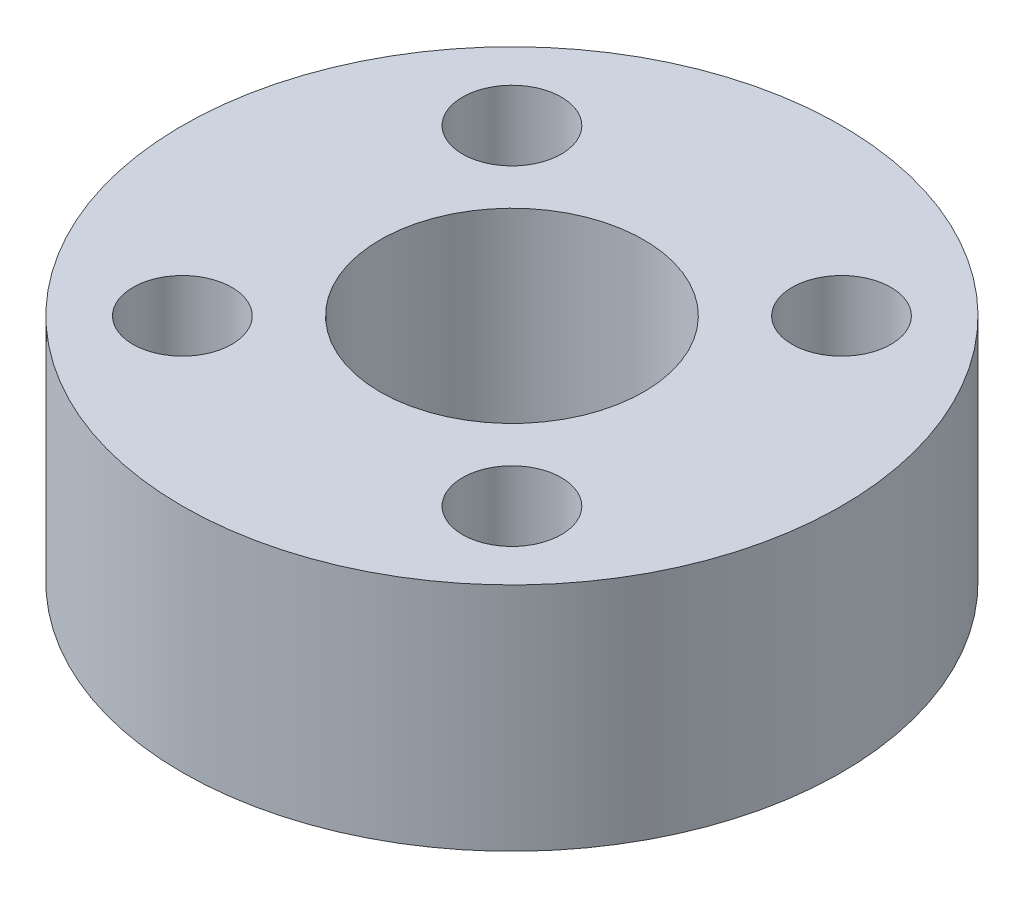
ISO-10303-21;
HEADER;
FILE_DESCRIPTION(('STEP AP214'),'2;1');
FILE_NAME('part.step','',(''),(''),'','','');
FILE_SCHEMA(('AUTOMOTIVE_DESIGN { 1 0 10303 214 1 1 1 1 }'));
ENDSEC;
DATA;
#1=APPLICATION_CONTEXT('core data for automotive mechanical design processes');
#2=APPLICATION_PROTOCOL_DEFINITION('international standard','automotive_design',2000,#1);
#3=PRODUCT_CONTEXT('',#1,'mechanical');
#4=PRODUCT('Part','Part','',(#3));
#5=PRODUCT_RELATED_PRODUCT_CATEGORY('part','',(#4));
#6=PRODUCT_DEFINITION_FORMATION('','',#4);
#7=PRODUCT_DEFINITION_CONTEXT('part definition',#1,'design');
#8=PRODUCT_DEFINITION('design','',#6,#7);
#9=PRODUCT_DEFINITION_SHAPE('','',#8);
#10=(LENGTH_UNIT() NAMED_UNIT(*) SI_UNIT(.MILLI.,.METRE.));
#11=(NAMED_UNIT(*) PLANE_ANGLE_UNIT() SI_UNIT($,.RADIAN.));
#12=(NAMED_UNIT(*) SI_UNIT($,.STERADIAN.) SOLID_ANGLE_UNIT());
#13=UNCERTAINTY_MEASURE_WITH_UNIT(LENGTH_MEASURE(1.E-05),#10,'distance_accuracy_value','');
#14=(GEOMETRIC_REPRESENTATION_CONTEXT(3) GLOBAL_UNCERTAINTY_ASSIGNED_CONTEXT((#13)) GLOBAL_UNIT_ASSIGNED_CONTEXT((#10,
#11,#12)) REPRESENTATION_CONTEXT('',''));
#15=CARTESIAN_POINT('',(0.,0.,0.));
#16=DIRECTION('',(0.,0.,1.));
#17=DIRECTION('',(1.,0.,0.));
#18=AXIS2_PLACEMENT_3D('',#15,#16,#17);
#19=CARTESIAN_POINT('',(0.,7.,0.));
#20=DIRECTION('',(0.,-1.,0.));
#21=DIRECTION('',(0.,0.,-1.));
#22=AXIS2_PLACEMENT_3D('',#19,#20,#21);
#23=CYLINDRICAL_SURFACE('',#22,10.);
#24=CARTESIAN_POINT('',(0.,7.,0.));
#25=DIRECTION('',(0.,1.,0.));
#26=DIRECTION('',(0.,0.,1.));
#27=AXIS2_PLACEMENT_3D('',#24,#25,#26);
#28=CIRCLE('',#27,10.);
#29=CARTESIAN_POINT('',(0.,7.,10.));
#30=VERTEX_POINT('',#29);
#31=EDGE_CURVE('E11',#30,#30,#28,.T.);
#32=ORIENTED_EDGE('',*,*,#31,.F.);
#33=EDGE_LOOP('',(#32));
#34=FACE_BOUND('',#33,.T.);
#35=CARTESIAN_POINT('',(0.,0.,0.));
#36=DIRECTION('',(0.,1.,0.));
#37=DIRECTION('',(0.,0.,1.));
#38=AXIS2_PLACEMENT_3D('',#35,#36,#37);
#39=CIRCLE('',#38,10.);
#40=CARTESIAN_POINT('',(0.,0.,10.));
#41=VERTEX_POINT('',#40);
#42=EDGE_CURVE('E70',#41,#41,#39,.T.);
#43=ORIENTED_EDGE('',*,*,#42,.T.);
#44=EDGE_LOOP('',(#43));
#45=FACE_BOUND('',#44,.T.);
#46=ADVANCED_FACE('F67',(#34,#45),#23,.T.);
#47=CARTESIAN_POINT('',(0.,7.,0.));
#48=DIRECTION('',(0.,1.,0.));
#49=DIRECTION('',(0.,0.,1.));
#50=AXIS2_PLACEMENT_3D('',#47,#48,#49);
#51=PLANE('',#50);
#52=CARTESIAN_POINT('',(5.,7.,-5.));
#53=DIRECTION('',(0.,1.,0.));
#54=DIRECTION('',(0.,0.,1.));
#55=AXIS2_PLACEMENT_3D('',#52,#53,#54);
#56=CIRCLE('',#55,1.5);
#57=CARTESIAN_POINT('',(5.,7.,-3.5));
#58=VERTEX_POINT('',#57);
#59=EDGE_CURVE('E93',#58,#58,#56,.T.);
#60=ORIENTED_EDGE('',*,*,#59,.F.);
#61=EDGE_LOOP('',(#60));
#62=FACE_BOUND('',#61,.T.);
#63=CARTESIAN_POINT('',(5.,7.,5.));
#64=DIRECTION('',(0.,1.,0.));
#65=DIRECTION('',(0.,0.,1.));
#66=AXIS2_PLACEMENT_3D('',#63,#64,#65);
#67=CIRCLE('',#66,1.5);
#68=CARTESIAN_POINT('',(5.,7.,6.5));
#69=VERTEX_POINT('',#68);
#70=EDGE_CURVE('E101',#69,#69,#67,.T.);
#71=ORIENTED_EDGE('',*,*,#70,.F.);
#72=EDGE_LOOP('',(#71));
#73=FACE_BOUND('',#72,.T.);
#74=CARTESIAN_POINT('',(-5.,7.,5.));
#75=DIRECTION('',(0.,1.,0.));
#76=DIRECTION('',(0.,0.,1.));
#77=AXIS2_PLACEMENT_3D('',#74,#75,#76);
#78=CIRCLE('',#77,1.5);
#79=CARTESIAN_POINT('',(-5.,7.,6.5));
#80=VERTEX_POINT('',#79);
#81=EDGE_CURVE('E109',#80,#80,#78,.T.);
#82=ORIENTED_EDGE('',*,*,#81,.F.);
#83=EDGE_LOOP('',(#82));
#84=FACE_BOUND('',#83,.T.);
#85=CARTESIAN_POINT('',(-5.,7.,-5.));
#86=DIRECTION('',(0.,1.,0.));
#87=DIRECTION('',(0.,0.,1.));
#88=AXIS2_PLACEMENT_3D('',#85,#86,#87);
#89=CIRCLE('',#88,1.5);
#90=CARTESIAN_POINT('',(-5.,7.,-3.5));
#91=VERTEX_POINT('',#90);
#92=EDGE_CURVE('E85',#91,#91,#89,.T.);
#93=ORIENTED_EDGE('',*,*,#92,.F.);
#94=EDGE_LOOP('',(#93));
#95=FACE_BOUND('',#94,.T.);
#96=CARTESIAN_POINT('',(0.,7.,0.));
#97=DIRECTION('',(0.,1.,0.));
#98=DIRECTION('',(0.,0.,1.));
#99=AXIS2_PLACEMENT_3D('',#96,#97,#98);
#100=CIRCLE('',#99,4.);
#101=CARTESIAN_POINT('',(0.,7.,4.));
#102=VERTEX_POINT('',#101);
#103=EDGE_CURVE('E81',#102,#102,#100,.T.);
#104=ORIENTED_EDGE('',*,*,#103,.F.);
#105=EDGE_LOOP('',(#104));
#106=FACE_BOUND('',#105,.T.);
#107=ORIENTED_EDGE('',*,*,#31,.T.);
#108=EDGE_LOOP('',(#107));
#109=FACE_BOUND('',#108,.T.);
#110=ADVANCED_FACE('F123',(#62,#73,#84,#95,#106,#109),#51,.T.);
#111=CARTESIAN_POINT('',(0.,0.,0.));
#112=DIRECTION('',(0.,1.,0.));
#113=DIRECTION('',(0.,0.,1.));
#114=AXIS2_PLACEMENT_3D('',#111,#112,#113);
#115=PLANE('',#114);
#116=CARTESIAN_POINT('',(5.,0.,-5.));
#117=DIRECTION('',(0.,1.,0.));
#118=DIRECTION('',(0.,0.,1.));
#119=AXIS2_PLACEMENT_3D('',#116,#117,#118);
#120=CIRCLE('',#119,1.5);
#121=CARTESIAN_POINT('',(5.,0.,-3.5));
#122=VERTEX_POINT('',#121);
#123=EDGE_CURVE('E89',#122,#122,#120,.T.);
#124=ORIENTED_EDGE('',*,*,#123,.T.);
#125=EDGE_LOOP('',(#124));
#126=FACE_BOUND('',#125,.T.);
#127=CARTESIAN_POINT('',(5.,0.,5.));
#128=DIRECTION('',(0.,1.,0.));
#129=DIRECTION('',(0.,0.,1.));
#130=AXIS2_PLACEMENT_3D('',#127,#128,#129);
#131=CIRCLE('',#130,1.5);
#132=CARTESIAN_POINT('',(5.,0.,6.5));
#133=VERTEX_POINT('',#132);
#134=EDGE_CURVE('E97',#133,#133,#131,.T.);
#135=ORIENTED_EDGE('',*,*,#134,.T.);
#136=EDGE_LOOP('',(#135));
#137=FACE_BOUND('',#136,.T.);
#138=CARTESIAN_POINT('',(-5.,0.,5.));
#139=DIRECTION('',(0.,1.,0.));
#140=DIRECTION('',(0.,0.,1.));
#141=AXIS2_PLACEMENT_3D('',#138,#139,#140);
#142=CIRCLE('',#141,1.5);
#143=CARTESIAN_POINT('',(-5.,0.,6.5));
#144=VERTEX_POINT('',#143);
#145=EDGE_CURVE('E105',#144,#144,#142,.T.);
#146=ORIENTED_EDGE('',*,*,#145,.T.);
#147=EDGE_LOOP('',(#146));
#148=FACE_BOUND('',#147,.T.);
#149=CARTESIAN_POINT('',(-5.,0.,-5.));
#150=DIRECTION('',(0.,1.,0.));
#151=DIRECTION('',(0.,0.,1.));
#152=AXIS2_PLACEMENT_3D('',#149,#150,#151);
#153=CIRCLE('',#152,1.5);
#154=CARTESIAN_POINT('',(-5.,0.,-3.5));
#155=VERTEX_POINT('',#154);
#156=EDGE_CURVE('E113',#155,#155,#153,.T.);
#157=ORIENTED_EDGE('',*,*,#156,.T.);
#158=EDGE_LOOP('',(#157));
#159=FACE_BOUND('',#158,.T.);
#160=CARTESIAN_POINT('',(0.,0.,0.));
#161=DIRECTION('',(0.,1.,0.));
#162=DIRECTION('',(0.,0.,1.));
#163=AXIS2_PLACEMENT_3D('',#160,#161,#162);
#164=CIRCLE('',#163,4.);
#165=CARTESIAN_POINT('',(0.,0.,4.));
#166=VERTEX_POINT('',#165);
#167=EDGE_CURVE('E79',#166,#166,#164,.T.);
#168=ORIENTED_EDGE('',*,*,#167,.T.);
#169=EDGE_LOOP('',(#168));
#170=FACE_BOUND('',#169,.T.);
#171=ORIENTED_EDGE('',*,*,#42,.F.);
#172=EDGE_LOOP('',(#171));
#173=FACE_BOUND('',#172,.T.);
#174=ADVANCED_FACE('F126',(#126,#137,#148,#159,#170,#173),#115,.F.);
#175=CARTESIAN_POINT('',(0.,0.,0.));
#176=DIRECTION('',(0.,1.,0.));
#177=DIRECTION('',(0.,0.,1.));
#178=AXIS2_PLACEMENT_3D('',#175,#176,#177);
#179=CYLINDRICAL_SURFACE('',#178,4.);
#180=ORIENTED_EDGE('',*,*,#167,.F.);
#181=EDGE_LOOP('',(#180));
#182=FACE_BOUND('',#181,.T.);
#183=ORIENTED_EDGE('',*,*,#103,.T.);
#184=EDGE_LOOP('',(#183));
#185=FACE_BOUND('',#184,.T.);
#186=ADVANCED_FACE('F131',(#182,#185),#179,.F.);
#187=CARTESIAN_POINT('',(-5.,0.,-5.));
#188=DIRECTION('',(0.,1.,0.));
#189=DIRECTION('',(0.,0.,1.));
#190=AXIS2_PLACEMENT_3D('',#187,#188,#189);
#191=CYLINDRICAL_SURFACE('',#190,1.5);
#192=ORIENTED_EDGE('',*,*,#156,.F.);
#193=EDGE_LOOP('',(#192));
#194=FACE_BOUND('',#193,.T.);
#195=ORIENTED_EDGE('',*,*,#92,.T.);
#196=EDGE_LOOP('',(#195));
#197=FACE_BOUND('',#196,.T.);
#198=ADVANCED_FACE('F121',(#194,#197),#191,.F.);
#199=CARTESIAN_POINT('',(-5.,0.,5.));
#200=DIRECTION('',(0.,1.,0.));
#201=DIRECTION('',(0.,0.,1.));
#202=AXIS2_PLACEMENT_3D('',#199,#200,#201);
#203=CYLINDRICAL_SURFACE('',#202,1.5);
#204=ORIENTED_EDGE('',*,*,#145,.F.);
#205=EDGE_LOOP('',(#204));
#206=FACE_BOUND('',#205,.T.);
#207=ORIENTED_EDGE('',*,*,#81,.T.);
#208=EDGE_LOOP('',(#207));
#209=FACE_BOUND('',#208,.T.);
#210=ADVANCED_FACE('F139',(#206,#209),#203,.F.);
#211=CARTESIAN_POINT('',(5.,0.,5.));
#212=DIRECTION('',(0.,1.,0.));
#213=DIRECTION('',(0.,0.,1.));
#214=AXIS2_PLACEMENT_3D('',#211,#212,#213);
#215=CYLINDRICAL_SURFACE('',#214,1.5);
#216=ORIENTED_EDGE('',*,*,#134,.F.);
#217=EDGE_LOOP('',(#216));
#218=FACE_BOUND('',#217,.T.);
#219=ORIENTED_EDGE('',*,*,#70,.T.);
#220=EDGE_LOOP('',(#219));
#221=FACE_BOUND('',#220,.T.);
#222=ADVANCED_FACE('F182',(#218,#221),#215,.F.);
#223=CARTESIAN_POINT('',(5.,0.,-5.));
#224=DIRECTION('',(0.,1.,0.));
#225=DIRECTION('',(0.,0.,1.));
#226=AXIS2_PLACEMENT_3D('',#223,#224,#225);
#227=CYLINDRICAL_SURFACE('',#226,1.5);
#228=ORIENTED_EDGE('',*,*,#123,.F.);
#229=EDGE_LOOP('',(#228));
#230=FACE_BOUND('',#229,.T.);
#231=ORIENTED_EDGE('',*,*,#59,.T.);
#232=EDGE_LOOP('',(#231));
#233=FACE_BOUND('',#232,.T.);
#234=ADVANCED_FACE('F192',(#230,#233),#227,.F.);
#235=CLOSED_SHELL('',(#46,#110,#174,#186,#198,#210,#222,#234));
#236=MANIFOLD_SOLID_BREP('B2',#235);
#237=ADVANCED_BREP_SHAPE_REPRESENTATION('',(#18,#236),#14);
#238=SHAPE_DEFINITION_REPRESENTATION(#9,#237);
ENDSEC;
END-ISO-10303-21;
